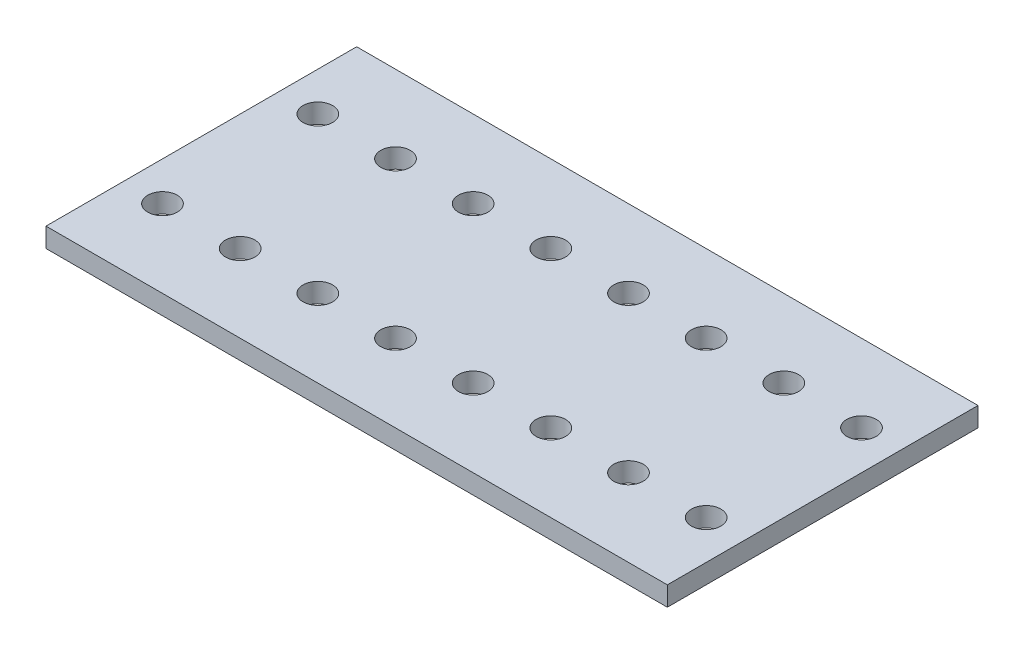
ISO-10303-21;
HEADER;
FILE_DESCRIPTION(('STEP AP214'),'2;1');
FILE_NAME('part.step','',(''),(''),'','','');
FILE_SCHEMA(('AUTOMOTIVE_DESIGN { 1 0 10303 214 1 1 1 1 }'));
ENDSEC;
DATA;
#1=APPLICATION_CONTEXT('core data for automotive mechanical design processes');
#2=APPLICATION_PROTOCOL_DEFINITION('international standard','automotive_design',2000,#1);
#3=PRODUCT_CONTEXT('',#1,'mechanical');
#4=PRODUCT('Part','Part','',(#3));
#5=PRODUCT_RELATED_PRODUCT_CATEGORY('part','',(#4));
#6=PRODUCT_DEFINITION_FORMATION('','',#4);
#7=PRODUCT_DEFINITION_CONTEXT('part definition',#1,'design');
#8=PRODUCT_DEFINITION('design','',#6,#7);
#9=PRODUCT_DEFINITION_SHAPE('','',#8);
#10=(LENGTH_UNIT() NAMED_UNIT(*) SI_UNIT(.MILLI.,.METRE.));
#11=(NAMED_UNIT(*) PLANE_ANGLE_UNIT() SI_UNIT($,.RADIAN.));
#12=(NAMED_UNIT(*) SI_UNIT($,.STERADIAN.) SOLID_ANGLE_UNIT());
#13=UNCERTAINTY_MEASURE_WITH_UNIT(LENGTH_MEASURE(1.E-05),#10,'distance_accuracy_value','');
#14=(GEOMETRIC_REPRESENTATION_CONTEXT(3) GLOBAL_UNCERTAINTY_ASSIGNED_CONTEXT((#13)) GLOBAL_UNIT_ASSIGNED_CONTEXT((#10,
#11,#12)) REPRESENTATION_CONTEXT('',''));
#15=CARTESIAN_POINT('',(0.,0.,0.));
#16=DIRECTION('',(0.,0.,1.));
#17=DIRECTION('',(1.,0.,0.));
#18=AXIS2_PLACEMENT_3D('',#15,#16,#17);
#19=CARTESIAN_POINT('',(0.,3.175,0.));
#20=DIRECTION('',(1.,0.,0.));
#21=DIRECTION('',(0.,0.,-1.));
#22=AXIS2_PLACEMENT_3D('',#19,#20,#21);
#23=PLANE('',#22);
#24=DIRECTION('',(0.,0.,1.));
#25=VECTOR('',#24,1.);
#26=CARTESIAN_POINT('',(0.,0.,0.));
#27=LINE('',#26,#25);
#28=CARTESIAN_POINT('',(0.,0.,-50.8));
#29=VERTEX_POINT('',#28);
#30=CARTESIAN_POINT('',(0.,0.,0.));
#31=VERTEX_POINT('',#30);
#32=EDGE_CURVE('E107',#29,#31,#27,.T.);
#33=ORIENTED_EDGE('',*,*,#32,.T.);
#34=DIRECTION('',(0.,-1.,0.));
#35=VECTOR('',#34,1.);
#36=CARTESIAN_POINT('',(0.,3.175,0.));
#37=LINE('',#36,#35);
#38=CARTESIAN_POINT('',(0.,3.175,0.));
#39=VERTEX_POINT('',#38);
#40=EDGE_CURVE('E11',#39,#31,#37,.T.);
#41=ORIENTED_EDGE('',*,*,#40,.F.);
#42=DIRECTION('',(0.,0.,1.));
#43=VECTOR('',#42,1.);
#44=CARTESIAN_POINT('',(0.,3.175,0.));
#45=LINE('',#44,#43);
#46=CARTESIAN_POINT('',(0.,3.175,-50.8));
#47=VERTEX_POINT('',#46);
#48=EDGE_CURVE('E91',#47,#39,#45,.T.);
#49=ORIENTED_EDGE('',*,*,#48,.F.);
#50=DIRECTION('',(0.,-1.,0.));
#51=VECTOR('',#50,1.);
#52=CARTESIAN_POINT('',(0.,3.175,-50.8));
#53=LINE('',#52,#51);
#54=EDGE_CURVE('E103',#47,#29,#53,.T.);
#55=ORIENTED_EDGE('',*,*,#54,.T.);
#56=EDGE_LOOP('',(#33,#41,#49,#55));
#57=FACE_BOUND('',#56,.T.);
#58=ADVANCED_FACE('F39',(#57),#23,.F.);
#59=CARTESIAN_POINT('',(0.,3.175,0.));
#60=DIRECTION('',(0.,0.,-1.));
#61=DIRECTION('',(-1.,0.,0.));
#62=AXIS2_PLACEMENT_3D('',#59,#60,#61);
#63=PLANE('',#62);
#64=DIRECTION('',(1.,0.,0.));
#65=VECTOR('',#64,1.);
#66=CARTESIAN_POINT('',(0.,0.,0.));
#67=LINE('',#66,#65);
#68=CARTESIAN_POINT('',(101.6,0.,0.));
#69=VERTEX_POINT('',#68);
#70=EDGE_CURVE('E96',#31,#69,#67,.T.);
#71=ORIENTED_EDGE('',*,*,#70,.T.);
#72=DIRECTION('',(0.,-1.,0.));
#73=VECTOR('',#72,1.);
#74=CARTESIAN_POINT('',(101.6,3.175,0.));
#75=LINE('',#74,#73);
#76=CARTESIAN_POINT('',(101.6,3.175,0.));
#77=VERTEX_POINT('',#76);
#78=EDGE_CURVE('E48',#77,#69,#75,.T.);
#79=ORIENTED_EDGE('',*,*,#78,.F.);
#80=DIRECTION('',(1.,0.,0.));
#81=VECTOR('',#80,1.);
#82=CARTESIAN_POINT('',(0.,3.175,0.));
#83=LINE('',#82,#81);
#84=EDGE_CURVE('E86',#39,#77,#83,.T.);
#85=ORIENTED_EDGE('',*,*,#84,.F.);
#86=ORIENTED_EDGE('',*,*,#40,.T.);
#87=EDGE_LOOP('',(#71,#79,#85,#86));
#88=FACE_BOUND('',#87,.T.);
#89=ADVANCED_FACE('F95',(#88),#63,.F.);
#90=CARTESIAN_POINT('',(101.6,3.175,0.));
#91=DIRECTION('',(-1.,0.,0.));
#92=DIRECTION('',(0.,0.,1.));
#93=AXIS2_PLACEMENT_3D('',#90,#91,#92);
#94=PLANE('',#93);
#95=DIRECTION('',(0.,0.,-1.));
#96=VECTOR('',#95,1.);
#97=CARTESIAN_POINT('',(101.6,0.,0.));
#98=LINE('',#97,#96);
#99=CARTESIAN_POINT('',(101.6,0.,-50.8));
#100=VERTEX_POINT('',#99);
#101=EDGE_CURVE('E73',#69,#100,#98,.T.);
#102=ORIENTED_EDGE('',*,*,#101,.T.);
#103=DIRECTION('',(0.,-1.,0.));
#104=VECTOR('',#103,1.);
#105=CARTESIAN_POINT('',(101.6,3.175,-50.8));
#106=LINE('',#105,#104);
#107=CARTESIAN_POINT('',(101.6,3.175,-50.8));
#108=VERTEX_POINT('',#107);
#109=EDGE_CURVE('E98',#108,#100,#106,.T.);
#110=ORIENTED_EDGE('',*,*,#109,.F.);
#111=DIRECTION('',(0.,0.,-1.));
#112=VECTOR('',#111,1.);
#113=CARTESIAN_POINT('',(101.6,3.175,0.));
#114=LINE('',#113,#112);
#115=EDGE_CURVE('E89',#77,#108,#114,.T.);
#116=ORIENTED_EDGE('',*,*,#115,.F.);
#117=ORIENTED_EDGE('',*,*,#78,.T.);
#118=EDGE_LOOP('',(#102,#110,#116,#117));
#119=FACE_BOUND('',#118,.T.);
#120=ADVANCED_FACE('F99',(#119),#94,.F.);
#121=CARTESIAN_POINT('',(0.,3.175,-50.8));
#122=DIRECTION('',(0.,0.,1.));
#123=DIRECTION('',(1.,0.,0.));
#124=AXIS2_PLACEMENT_3D('',#121,#122,#123);
#125=PLANE('',#124);
#126=DIRECTION('',(-1.,0.,0.));
#127=VECTOR('',#126,1.);
#128=CARTESIAN_POINT('',(0.,0.,-50.8));
#129=LINE('',#128,#127);
#130=EDGE_CURVE('E79',#100,#29,#129,.T.);
#131=ORIENTED_EDGE('',*,*,#130,.T.);
#132=ORIENTED_EDGE('',*,*,#54,.F.);
#133=DIRECTION('',(-1.,0.,0.));
#134=VECTOR('',#133,1.);
#135=CARTESIAN_POINT('',(0.,3.175,-50.8));
#136=LINE('',#135,#134);
#137=EDGE_CURVE('E56',#108,#47,#136,.T.);
#138=ORIENTED_EDGE('',*,*,#137,.F.);
#139=ORIENTED_EDGE('',*,*,#109,.T.);
#140=EDGE_LOOP('',(#131,#132,#138,#139));
#141=FACE_BOUND('',#140,.T.);
#142=ADVANCED_FACE('F121',(#141),#125,.F.);
#143=CARTESIAN_POINT('',(0.,3.175,0.));
#144=DIRECTION('',(0.,-1.,0.));
#145=DIRECTION('',(0.,0.,-1.));
#146=AXIS2_PLACEMENT_3D('',#143,#144,#145);
#147=PLANE('',#146);
#148=CARTESIAN_POINT('',(31.75,3.175,-12.7));
#149=DIRECTION('',(0.,1.,0.));
#150=DIRECTION('',(0.,0.,1.));
#151=AXIS2_PLACEMENT_3D('',#148,#149,#150);
#152=CIRCLE('',#151,2.413);
#153=CARTESIAN_POINT('',(31.75,3.175,-10.287));
#154=VERTEX_POINT('',#153);
#155=EDGE_CURVE('E177',#154,#154,#152,.T.);
#156=ORIENTED_EDGE('',*,*,#155,.F.);
#157=EDGE_LOOP('',(#156));
#158=FACE_BOUND('',#157,.T.);
#159=CARTESIAN_POINT('',(44.45,3.175,-38.1));
#160=DIRECTION('',(0.,1.,0.));
#161=DIRECTION('',(0.,0.,1.));
#162=AXIS2_PLACEMENT_3D('',#159,#160,#161);
#163=CIRCLE('',#162,2.413);
#164=CARTESIAN_POINT('',(44.45,3.175,-35.687));
#165=VERTEX_POINT('',#164);
#166=EDGE_CURVE('E168',#165,#165,#163,.T.);
#167=ORIENTED_EDGE('',*,*,#166,.F.);
#168=EDGE_LOOP('',(#167));
#169=FACE_BOUND('',#168,.T.);
#170=CARTESIAN_POINT('',(44.45,3.175,-12.7));
#171=DIRECTION('',(0.,1.,0.));
#172=DIRECTION('',(0.,0.,1.));
#173=AXIS2_PLACEMENT_3D('',#170,#171,#172);
#174=CIRCLE('',#173,2.413);
#175=CARTESIAN_POINT('',(44.45,3.175,-10.287));
#176=VERTEX_POINT('',#175);
#177=EDGE_CURVE('E193',#176,#176,#174,.T.);
#178=ORIENTED_EDGE('',*,*,#177,.F.);
#179=EDGE_LOOP('',(#178));
#180=FACE_BOUND('',#179,.T.);
#181=CARTESIAN_POINT('',(57.15,3.175,-38.1));
#182=DIRECTION('',(0.,1.,0.));
#183=DIRECTION('',(0.,0.,1.));
#184=AXIS2_PLACEMENT_3D('',#181,#182,#183);
#185=CIRCLE('',#184,2.413);
#186=CARTESIAN_POINT('',(57.15,3.175,-35.687));
#187=VERTEX_POINT('',#186);
#188=EDGE_CURVE('E184',#187,#187,#185,.T.);
#189=ORIENTED_EDGE('',*,*,#188,.F.);
#190=EDGE_LOOP('',(#189));
#191=FACE_BOUND('',#190,.T.);
#192=CARTESIAN_POINT('',(6.35,3.175,-12.7));
#193=DIRECTION('',(0.,1.,0.));
#194=DIRECTION('',(0.,0.,1.));
#195=AXIS2_PLACEMENT_3D('',#192,#193,#194);
#196=CIRCLE('',#195,2.413);
#197=CARTESIAN_POINT('',(6.35,3.175,-10.287));
#198=VERTEX_POINT('',#197);
#199=EDGE_CURVE('E145',#198,#198,#196,.T.);
#200=ORIENTED_EDGE('',*,*,#199,.F.);
#201=EDGE_LOOP('',(#200));
#202=FACE_BOUND('',#201,.T.);
#203=CARTESIAN_POINT('',(19.05,3.175,-38.1));
#204=DIRECTION('',(0.,1.,0.));
#205=DIRECTION('',(0.,0.,1.));
#206=AXIS2_PLACEMENT_3D('',#203,#204,#205);
#207=CIRCLE('',#206,2.413);
#208=CARTESIAN_POINT('',(19.05,3.175,-35.687));
#209=VERTEX_POINT('',#208);
#210=EDGE_CURVE('E136',#209,#209,#207,.T.);
#211=ORIENTED_EDGE('',*,*,#210,.F.);
#212=EDGE_LOOP('',(#211));
#213=FACE_BOUND('',#212,.T.);
#214=CARTESIAN_POINT('',(19.05,3.175,-12.7));
#215=DIRECTION('',(0.,1.,0.));
#216=DIRECTION('',(0.,0.,1.));
#217=AXIS2_PLACEMENT_3D('',#214,#215,#216);
#218=CIRCLE('',#217,2.413);
#219=CARTESIAN_POINT('',(19.05,3.175,-10.287));
#220=VERTEX_POINT('',#219);
#221=EDGE_CURVE('E161',#220,#220,#218,.T.);
#222=ORIENTED_EDGE('',*,*,#221,.F.);
#223=EDGE_LOOP('',(#222));
#224=FACE_BOUND('',#223,.T.);
#225=CARTESIAN_POINT('',(31.75,3.175,-38.1));
#226=DIRECTION('',(0.,1.,0.));
#227=DIRECTION('',(0.,0.,1.));
#228=AXIS2_PLACEMENT_3D('',#225,#226,#227);
#229=CIRCLE('',#228,2.41299999999999);
#230=CARTESIAN_POINT('',(31.75,3.175,-35.687));
#231=VERTEX_POINT('',#230);
#232=EDGE_CURVE('E152',#231,#231,#229,.T.);
#233=ORIENTED_EDGE('',*,*,#232,.F.);
#234=EDGE_LOOP('',(#233));
#235=FACE_BOUND('',#234,.T.);
#236=CARTESIAN_POINT('',(82.55,3.175,-12.7));
#237=DIRECTION('',(0.,1.,0.));
#238=DIRECTION('',(0.,0.,1.));
#239=AXIS2_PLACEMENT_3D('',#236,#237,#238);
#240=CIRCLE('',#239,2.41300000000001);
#241=CARTESIAN_POINT('',(82.55,3.175,-10.287));
#242=VERTEX_POINT('',#241);
#243=EDGE_CURVE('E241',#242,#242,#240,.T.);
#244=ORIENTED_EDGE('',*,*,#243,.F.);
#245=EDGE_LOOP('',(#244));
#246=FACE_BOUND('',#245,.T.);
#247=CARTESIAN_POINT('',(95.25,3.175,-38.1));
#248=DIRECTION('',(0.,1.,0.));
#249=DIRECTION('',(0.,0.,1.));
#250=AXIS2_PLACEMENT_3D('',#247,#248,#249);
#251=CIRCLE('',#250,2.41300000000001);
#252=CARTESIAN_POINT('',(95.25,3.175,-35.687));
#253=VERTEX_POINT('',#252);
#254=EDGE_CURVE('E232',#253,#253,#251,.T.);
#255=ORIENTED_EDGE('',*,*,#254,.F.);
#256=EDGE_LOOP('',(#255));
#257=FACE_BOUND('',#256,.T.);
#258=CARTESIAN_POINT('',(95.25,3.175,-12.7));
#259=DIRECTION('',(0.,1.,0.));
#260=DIRECTION('',(0.,0.,1.));
#261=AXIS2_PLACEMENT_3D('',#258,#259,#260);
#262=CIRCLE('',#261,2.41300000000001);
#263=CARTESIAN_POINT('',(95.25,3.175,-10.287));
#264=VERTEX_POINT('',#263);
#265=EDGE_CURVE('E248',#264,#264,#262,.T.);
#266=ORIENTED_EDGE('',*,*,#265,.F.);
#267=EDGE_LOOP('',(#266));
#268=FACE_BOUND('',#267,.T.);
#269=CARTESIAN_POINT('',(57.15,3.175,-12.7));
#270=DIRECTION('',(0.,1.,0.));
#271=DIRECTION('',(0.,0.,1.));
#272=AXIS2_PLACEMENT_3D('',#269,#270,#271);
#273=CIRCLE('',#272,2.413);
#274=CARTESIAN_POINT('',(57.15,3.175,-10.287));
#275=VERTEX_POINT('',#274);
#276=EDGE_CURVE('E209',#275,#275,#273,.T.);
#277=ORIENTED_EDGE('',*,*,#276,.F.);
#278=EDGE_LOOP('',(#277));
#279=FACE_BOUND('',#278,.T.);
#280=CARTESIAN_POINT('',(69.85,3.175,-38.1));
#281=DIRECTION('',(0.,1.,0.));
#282=DIRECTION('',(0.,0.,1.));
#283=AXIS2_PLACEMENT_3D('',#280,#281,#282);
#284=CIRCLE('',#283,2.41300000000001);
#285=CARTESIAN_POINT('',(69.85,3.175,-35.687));
#286=VERTEX_POINT('',#285);
#287=EDGE_CURVE('E200',#286,#286,#284,.T.);
#288=ORIENTED_EDGE('',*,*,#287,.F.);
#289=EDGE_LOOP('',(#288));
#290=FACE_BOUND('',#289,.T.);
#291=CARTESIAN_POINT('',(69.85,3.175,-12.7));
#292=DIRECTION('',(0.,1.,0.));
#293=DIRECTION('',(0.,0.,1.));
#294=AXIS2_PLACEMENT_3D('',#291,#292,#293);
#295=CIRCLE('',#294,2.41300000000001);
#296=CARTESIAN_POINT('',(69.85,3.175,-10.287));
#297=VERTEX_POINT('',#296);
#298=EDGE_CURVE('E225',#297,#297,#295,.T.);
#299=ORIENTED_EDGE('',*,*,#298,.F.);
#300=EDGE_LOOP('',(#299));
#301=FACE_BOUND('',#300,.T.);
#302=CARTESIAN_POINT('',(82.55,3.175,-38.1));
#303=DIRECTION('',(0.,1.,0.));
#304=DIRECTION('',(0.,0.,1.));
#305=AXIS2_PLACEMENT_3D('',#302,#303,#304);
#306=CIRCLE('',#305,2.41300000000001);
#307=CARTESIAN_POINT('',(82.55,3.175,-35.687));
#308=VERTEX_POINT('',#307);
#309=EDGE_CURVE('E216',#308,#308,#306,.T.);
#310=ORIENTED_EDGE('',*,*,#309,.F.);
#311=EDGE_LOOP('',(#310));
#312=FACE_BOUND('',#311,.T.);
#313=CARTESIAN_POINT('',(6.35,3.175,-38.1));
#314=DIRECTION('',(0.,1.,0.));
#315=DIRECTION('',(0.,0.,1.));
#316=AXIS2_PLACEMENT_3D('',#313,#314,#315);
#317=CIRCLE('',#316,2.413);
#318=CARTESIAN_POINT('',(6.35,3.175,-35.687));
#319=VERTEX_POINT('',#318);
#320=EDGE_CURVE('E128',#319,#319,#317,.T.);
#321=ORIENTED_EDGE('',*,*,#320,.F.);
#322=EDGE_LOOP('',(#321));
#323=FACE_BOUND('',#322,.T.);
#324=ORIENTED_EDGE('',*,*,#48,.T.);
#325=ORIENTED_EDGE('',*,*,#84,.T.);
#326=ORIENTED_EDGE('',*,*,#115,.T.);
#327=ORIENTED_EDGE('',*,*,#137,.T.);
#328=EDGE_LOOP('',(#324,#325,#326,#327));
#329=FACE_BOUND('',#328,.T.);
#330=ADVANCED_FACE('F87',(#158,#169,#180,#191,#202,#213,#224,#235,#246,#257,#268,#279,#290,#301,
#312,#323,#329),#147,.F.);
#331=CARTESIAN_POINT('',(0.,0.,0.));
#332=DIRECTION('',(0.,-1.,0.));
#333=DIRECTION('',(0.,0.,-1.));
#334=AXIS2_PLACEMENT_3D('',#331,#332,#333);
#335=PLANE('',#334);
#336=CARTESIAN_POINT('',(31.75,0.,-12.7));
#337=DIRECTION('',(0.,1.,0.));
#338=DIRECTION('',(0.,0.,1.));
#339=AXIS2_PLACEMENT_3D('',#336,#337,#338);
#340=CIRCLE('',#339,2.413);
#341=CARTESIAN_POINT('',(31.75,0.,-10.287));
#342=VERTEX_POINT('',#341);
#343=EDGE_CURVE('E157',#342,#342,#340,.T.);
#344=ORIENTED_EDGE('',*,*,#343,.T.);
#345=EDGE_LOOP('',(#344));
#346=FACE_BOUND('',#345,.T.);
#347=CARTESIAN_POINT('',(44.45,0.,-38.1));
#348=DIRECTION('',(0.,1.,0.));
#349=DIRECTION('',(0.,0.,1.));
#350=AXIS2_PLACEMENT_3D('',#347,#348,#349);
#351=CIRCLE('',#350,2.413);
#352=CARTESIAN_POINT('',(44.45,0.,-35.687));
#353=VERTEX_POINT('',#352);
#354=EDGE_CURVE('E172',#353,#353,#351,.T.);
#355=ORIENTED_EDGE('',*,*,#354,.T.);
#356=EDGE_LOOP('',(#355));
#357=FACE_BOUND('',#356,.T.);
#358=CARTESIAN_POINT('',(44.45,0.,-12.7));
#359=DIRECTION('',(0.,1.,0.));
#360=DIRECTION('',(0.,0.,1.));
#361=AXIS2_PLACEMENT_3D('',#358,#359,#360);
#362=CIRCLE('',#361,2.413);
#363=CARTESIAN_POINT('',(44.45,0.,-10.287));
#364=VERTEX_POINT('',#363);
#365=EDGE_CURVE('E173',#364,#364,#362,.T.);
#366=ORIENTED_EDGE('',*,*,#365,.T.);
#367=EDGE_LOOP('',(#366));
#368=FACE_BOUND('',#367,.T.);
#369=CARTESIAN_POINT('',(57.15,0.,-38.1));
#370=DIRECTION('',(0.,1.,0.));
#371=DIRECTION('',(0.,0.,1.));
#372=AXIS2_PLACEMENT_3D('',#369,#370,#371);
#373=CIRCLE('',#372,2.413);
#374=CARTESIAN_POINT('',(57.15,0.,-35.687));
#375=VERTEX_POINT('',#374);
#376=EDGE_CURVE('E188',#375,#375,#373,.T.);
#377=ORIENTED_EDGE('',*,*,#376,.T.);
#378=EDGE_LOOP('',(#377));
#379=FACE_BOUND('',#378,.T.);
#380=CARTESIAN_POINT('',(6.35,0.,-12.7));
#381=DIRECTION('',(0.,1.,0.));
#382=DIRECTION('',(0.,0.,1.));
#383=AXIS2_PLACEMENT_3D('',#380,#381,#382);
#384=CIRCLE('',#383,2.413);
#385=CARTESIAN_POINT('',(6.35,0.,-10.287));
#386=VERTEX_POINT('',#385);
#387=EDGE_CURVE('E132',#386,#386,#384,.T.);
#388=ORIENTED_EDGE('',*,*,#387,.T.);
#389=EDGE_LOOP('',(#388));
#390=FACE_BOUND('',#389,.T.);
#391=CARTESIAN_POINT('',(19.05,0.,-38.1));
#392=DIRECTION('',(0.,1.,0.));
#393=DIRECTION('',(0.,0.,1.));
#394=AXIS2_PLACEMENT_3D('',#391,#392,#393);
#395=CIRCLE('',#394,2.413);
#396=CARTESIAN_POINT('',(19.05,0.,-35.687));
#397=VERTEX_POINT('',#396);
#398=EDGE_CURVE('E140',#397,#397,#395,.T.);
#399=ORIENTED_EDGE('',*,*,#398,.T.);
#400=EDGE_LOOP('',(#399));
#401=FACE_BOUND('',#400,.T.);
#402=CARTESIAN_POINT('',(19.05,0.,-12.7));
#403=DIRECTION('',(0.,1.,0.));
#404=DIRECTION('',(0.,0.,1.));
#405=AXIS2_PLACEMENT_3D('',#402,#403,#404);
#406=CIRCLE('',#405,2.413);
#407=CARTESIAN_POINT('',(19.05,0.,-10.287));
#408=VERTEX_POINT('',#407);
#409=EDGE_CURVE('E141',#408,#408,#406,.T.);
#410=ORIENTED_EDGE('',*,*,#409,.T.);
#411=EDGE_LOOP('',(#410));
#412=FACE_BOUND('',#411,.T.);
#413=CARTESIAN_POINT('',(31.75,0.,-38.1));
#414=DIRECTION('',(0.,1.,0.));
#415=DIRECTION('',(0.,0.,1.));
#416=AXIS2_PLACEMENT_3D('',#413,#414,#415);
#417=CIRCLE('',#416,2.41299999999999);
#418=CARTESIAN_POINT('',(31.75,0.,-35.687));
#419=VERTEX_POINT('',#418);
#420=EDGE_CURVE('E156',#419,#419,#417,.T.);
#421=ORIENTED_EDGE('',*,*,#420,.T.);
#422=EDGE_LOOP('',(#421));
#423=FACE_BOUND('',#422,.T.);
#424=CARTESIAN_POINT('',(82.55,0.,-12.7));
#425=DIRECTION('',(0.,1.,0.));
#426=DIRECTION('',(0.,0.,1.));
#427=AXIS2_PLACEMENT_3D('',#424,#425,#426);
#428=CIRCLE('',#427,2.41300000000001);
#429=CARTESIAN_POINT('',(82.55,0.,-10.287));
#430=VERTEX_POINT('',#429);
#431=EDGE_CURVE('E221',#430,#430,#428,.T.);
#432=ORIENTED_EDGE('',*,*,#431,.T.);
#433=EDGE_LOOP('',(#432));
#434=FACE_BOUND('',#433,.T.);
#435=CARTESIAN_POINT('',(95.25,0.,-38.1));
#436=DIRECTION('',(0.,1.,0.));
#437=DIRECTION('',(0.,0.,1.));
#438=AXIS2_PLACEMENT_3D('',#435,#436,#437);
#439=CIRCLE('',#438,2.41300000000001);
#440=CARTESIAN_POINT('',(95.25,0.,-35.687));
#441=VERTEX_POINT('',#440);
#442=EDGE_CURVE('E236',#441,#441,#439,.T.);
#443=ORIENTED_EDGE('',*,*,#442,.T.);
#444=EDGE_LOOP('',(#443));
#445=FACE_BOUND('',#444,.T.);
#446=CARTESIAN_POINT('',(95.25,0.,-12.7));
#447=DIRECTION('',(0.,1.,0.));
#448=DIRECTION('',(0.,0.,1.));
#449=AXIS2_PLACEMENT_3D('',#446,#447,#448);
#450=CIRCLE('',#449,2.41300000000001);
#451=CARTESIAN_POINT('',(95.25,0.,-10.287));
#452=VERTEX_POINT('',#451);
#453=EDGE_CURVE('E237',#452,#452,#450,.T.);
#454=ORIENTED_EDGE('',*,*,#453,.T.);
#455=EDGE_LOOP('',(#454));
#456=FACE_BOUND('',#455,.T.);
#457=CARTESIAN_POINT('',(57.15,0.,-12.7));
#458=DIRECTION('',(0.,1.,0.));
#459=DIRECTION('',(0.,0.,1.));
#460=AXIS2_PLACEMENT_3D('',#457,#458,#459);
#461=CIRCLE('',#460,2.413);
#462=CARTESIAN_POINT('',(57.15,0.,-10.287));
#463=VERTEX_POINT('',#462);
#464=EDGE_CURVE('E189',#463,#463,#461,.T.);
#465=ORIENTED_EDGE('',*,*,#464,.T.);
#466=EDGE_LOOP('',(#465));
#467=FACE_BOUND('',#466,.T.);
#468=CARTESIAN_POINT('',(69.85,0.,-38.1));
#469=DIRECTION('',(0.,1.,0.));
#470=DIRECTION('',(0.,0.,1.));
#471=AXIS2_PLACEMENT_3D('',#468,#469,#470);
#472=CIRCLE('',#471,2.41300000000001);
#473=CARTESIAN_POINT('',(69.85,0.,-35.687));
#474=VERTEX_POINT('',#473);
#475=EDGE_CURVE('E204',#474,#474,#472,.T.);
#476=ORIENTED_EDGE('',*,*,#475,.T.);
#477=EDGE_LOOP('',(#476));
#478=FACE_BOUND('',#477,.T.);
#479=CARTESIAN_POINT('',(69.85,0.,-12.7));
#480=DIRECTION('',(0.,1.,0.));
#481=DIRECTION('',(0.,0.,1.));
#482=AXIS2_PLACEMENT_3D('',#479,#480,#481);
#483=CIRCLE('',#482,2.41300000000001);
#484=CARTESIAN_POINT('',(69.85,0.,-10.287));
#485=VERTEX_POINT('',#484);
#486=EDGE_CURVE('E205',#485,#485,#483,.T.);
#487=ORIENTED_EDGE('',*,*,#486,.T.);
#488=EDGE_LOOP('',(#487));
#489=FACE_BOUND('',#488,.T.);
#490=CARTESIAN_POINT('',(82.55,0.,-38.1));
#491=DIRECTION('',(0.,1.,0.));
#492=DIRECTION('',(0.,0.,1.));
#493=AXIS2_PLACEMENT_3D('',#490,#491,#492);
#494=CIRCLE('',#493,2.41300000000001);
#495=CARTESIAN_POINT('',(82.55,0.,-35.687));
#496=VERTEX_POINT('',#495);
#497=EDGE_CURVE('E220',#496,#496,#494,.T.);
#498=ORIENTED_EDGE('',*,*,#497,.T.);
#499=EDGE_LOOP('',(#498));
#500=FACE_BOUND('',#499,.T.);
#501=CARTESIAN_POINT('',(6.35,0.,-38.1));
#502=DIRECTION('',(0.,1.,0.));
#503=DIRECTION('',(0.,0.,1.));
#504=AXIS2_PLACEMENT_3D('',#501,#502,#503);
#505=CIRCLE('',#504,2.413);
#506=CARTESIAN_POINT('',(6.35,0.,-35.687));
#507=VERTEX_POINT('',#506);
#508=EDGE_CURVE('E111',#507,#507,#505,.T.);
#509=ORIENTED_EDGE('',*,*,#508,.T.);
#510=EDGE_LOOP('',(#509));
#511=FACE_BOUND('',#510,.T.);
#512=ORIENTED_EDGE('',*,*,#32,.F.);
#513=ORIENTED_EDGE('',*,*,#130,.F.);
#514=ORIENTED_EDGE('',*,*,#101,.F.);
#515=ORIENTED_EDGE('',*,*,#70,.F.);
#516=EDGE_LOOP('',(#512,#513,#514,#515));
#517=FACE_BOUND('',#516,.T.);
#518=ADVANCED_FACE('F124',(#346,#357,#368,#379,#390,#401,#412,#423,#434,#445,#456,#467,#478,
#489,#500,#511,#517),#335,.T.);
#519=CARTESIAN_POINT('',(6.35,0.,-38.1));
#520=DIRECTION('',(0.,1.,0.));
#521=DIRECTION('',(0.,0.,1.));
#522=AXIS2_PLACEMENT_3D('',#519,#520,#521);
#523=CYLINDRICAL_SURFACE('',#522,2.413);
#524=ORIENTED_EDGE('',*,*,#508,.F.);
#525=EDGE_LOOP('',(#524));
#526=FACE_BOUND('',#525,.T.);
#527=ORIENTED_EDGE('',*,*,#320,.T.);
#528=EDGE_LOOP('',(#527));
#529=FACE_BOUND('',#528,.T.);
#530=ADVANCED_FACE('F280',(#526,#529),#523,.F.);
#531=CARTESIAN_POINT('',(82.55,0.,-38.1));
#532=DIRECTION('',(0.,1.,0.));
#533=DIRECTION('',(0.,0.,1.));
#534=AXIS2_PLACEMENT_3D('',#531,#532,#533);
#535=CYLINDRICAL_SURFACE('',#534,2.41300000000001);
#536=ORIENTED_EDGE('',*,*,#497,.F.);
#537=EDGE_LOOP('',(#536));
#538=FACE_BOUND('',#537,.T.);
#539=ORIENTED_EDGE('',*,*,#309,.T.);
#540=EDGE_LOOP('',(#539));
#541=FACE_BOUND('',#540,.T.);
#542=ADVANCED_FACE('F282',(#538,#541),#535,.F.);
#543=CARTESIAN_POINT('',(69.85,0.,-12.7));
#544=DIRECTION('',(0.,1.,0.));
#545=DIRECTION('',(0.,0.,1.));
#546=AXIS2_PLACEMENT_3D('',#543,#544,#545);
#547=CYLINDRICAL_SURFACE('',#546,2.41300000000001);
#548=ORIENTED_EDGE('',*,*,#486,.F.);
#549=EDGE_LOOP('',(#548));
#550=FACE_BOUND('',#549,.T.);
#551=ORIENTED_EDGE('',*,*,#298,.T.);
#552=EDGE_LOOP('',(#551));
#553=FACE_BOUND('',#552,.T.);
#554=ADVANCED_FACE('F289',(#550,#553),#547,.F.);
#555=CARTESIAN_POINT('',(69.85,0.,-38.1));
#556=DIRECTION('',(0.,1.,0.));
#557=DIRECTION('',(0.,0.,1.));
#558=AXIS2_PLACEMENT_3D('',#555,#556,#557);
#559=CYLINDRICAL_SURFACE('',#558,2.41300000000001);
#560=ORIENTED_EDGE('',*,*,#475,.F.);
#561=EDGE_LOOP('',(#560));
#562=FACE_BOUND('',#561,.T.);
#563=ORIENTED_EDGE('',*,*,#287,.T.);
#564=EDGE_LOOP('',(#563));
#565=FACE_BOUND('',#564,.T.);
#566=ADVANCED_FACE('F337',(#562,#565),#559,.F.);
#567=CARTESIAN_POINT('',(57.15,0.,-12.7));
#568=DIRECTION('',(0.,1.,0.));
#569=DIRECTION('',(0.,0.,1.));
#570=AXIS2_PLACEMENT_3D('',#567,#568,#569);
#571=CYLINDRICAL_SURFACE('',#570,2.413);
#572=ORIENTED_EDGE('',*,*,#464,.F.);
#573=EDGE_LOOP('',(#572));
#574=FACE_BOUND('',#573,.T.);
#575=ORIENTED_EDGE('',*,*,#276,.T.);
#576=EDGE_LOOP('',(#575));
#577=FACE_BOUND('',#576,.T.);
#578=ADVANCED_FACE('F262',(#574,#577),#571,.F.);
#579=CARTESIAN_POINT('',(95.25,0.,-12.7));
#580=DIRECTION('',(0.,1.,0.));
#581=DIRECTION('',(0.,0.,1.));
#582=AXIS2_PLACEMENT_3D('',#579,#580,#581);
#583=CYLINDRICAL_SURFACE('',#582,2.41300000000001);
#584=ORIENTED_EDGE('',*,*,#453,.F.);
#585=EDGE_LOOP('',(#584));
#586=FACE_BOUND('',#585,.T.);
#587=ORIENTED_EDGE('',*,*,#265,.T.);
#588=EDGE_LOOP('',(#587));
#589=FACE_BOUND('',#588,.T.);
#590=ADVANCED_FACE('F258',(#586,#589),#583,.F.);
#591=CARTESIAN_POINT('',(95.25,0.,-38.1));
#592=DIRECTION('',(0.,1.,0.));
#593=DIRECTION('',(0.,0.,1.));
#594=AXIS2_PLACEMENT_3D('',#591,#592,#593);
#595=CYLINDRICAL_SURFACE('',#594,2.41300000000001);
#596=ORIENTED_EDGE('',*,*,#442,.F.);
#597=EDGE_LOOP('',(#596));
#598=FACE_BOUND('',#597,.T.);
#599=ORIENTED_EDGE('',*,*,#254,.T.);
#600=EDGE_LOOP('',(#599));
#601=FACE_BOUND('',#600,.T.);
#602=ADVANCED_FACE('F261',(#598,#601),#595,.F.);
#603=CARTESIAN_POINT('',(82.55,0.,-12.7));
#604=DIRECTION('',(0.,1.,0.));
#605=DIRECTION('',(0.,0.,1.));
#606=AXIS2_PLACEMENT_3D('',#603,#604,#605);
#607=CYLINDRICAL_SURFACE('',#606,2.41300000000001);
#608=ORIENTED_EDGE('',*,*,#431,.F.);
#609=EDGE_LOOP('',(#608));
#610=FACE_BOUND('',#609,.T.);
#611=ORIENTED_EDGE('',*,*,#243,.T.);
#612=EDGE_LOOP('',(#611));
#613=FACE_BOUND('',#612,.T.);
#614=ADVANCED_FACE('F371',(#610,#613),#607,.F.);
#615=CARTESIAN_POINT('',(31.75,0.,-38.1));
#616=DIRECTION('',(0.,1.,0.));
#617=DIRECTION('',(0.,0.,1.));
#618=AXIS2_PLACEMENT_3D('',#615,#616,#617);
#619=CYLINDRICAL_SURFACE('',#618,2.41299999999999);
#620=ORIENTED_EDGE('',*,*,#420,.F.);
#621=EDGE_LOOP('',(#620));
#622=FACE_BOUND('',#621,.T.);
#623=ORIENTED_EDGE('',*,*,#232,.T.);
#624=EDGE_LOOP('',(#623));
#625=FACE_BOUND('',#624,.T.);
#626=ADVANCED_FACE('F381',(#622,#625),#619,.F.);
#627=CARTESIAN_POINT('',(19.05,0.,-12.7));
#628=DIRECTION('',(0.,1.,0.));
#629=DIRECTION('',(0.,0.,1.));
#630=AXIS2_PLACEMENT_3D('',#627,#628,#629);
#631=CYLINDRICAL_SURFACE('',#630,2.413);
#632=ORIENTED_EDGE('',*,*,#409,.F.);
#633=EDGE_LOOP('',(#632));
#634=FACE_BOUND('',#633,.T.);
#635=ORIENTED_EDGE('',*,*,#221,.T.);
#636=EDGE_LOOP('',(#635));
#637=FACE_BOUND('',#636,.T.);
#638=ADVANCED_FACE('F391',(#634,#637),#631,.F.);
#639=CARTESIAN_POINT('',(19.05,0.,-38.1));
#640=DIRECTION('',(0.,1.,0.));
#641=DIRECTION('',(0.,0.,1.));
#642=AXIS2_PLACEMENT_3D('',#639,#640,#641);
#643=CYLINDRICAL_SURFACE('',#642,2.413);
#644=ORIENTED_EDGE('',*,*,#398,.F.);
#645=EDGE_LOOP('',(#644));
#646=FACE_BOUND('',#645,.T.);
#647=ORIENTED_EDGE('',*,*,#210,.T.);
#648=EDGE_LOOP('',(#647));
#649=FACE_BOUND('',#648,.T.);
#650=ADVANCED_FACE('F401',(#646,#649),#643,.F.);
#651=CARTESIAN_POINT('',(6.35,0.,-12.7));
#652=DIRECTION('',(0.,1.,0.));
#653=DIRECTION('',(0.,0.,1.));
#654=AXIS2_PLACEMENT_3D('',#651,#652,#653);
#655=CYLINDRICAL_SURFACE('',#654,2.413);
#656=ORIENTED_EDGE('',*,*,#387,.F.);
#657=EDGE_LOOP('',(#656));
#658=FACE_BOUND('',#657,.T.);
#659=ORIENTED_EDGE('',*,*,#199,.T.);
#660=EDGE_LOOP('',(#659));
#661=FACE_BOUND('',#660,.T.);
#662=ADVANCED_FACE('F411',(#658,#661),#655,.F.);
#663=CARTESIAN_POINT('',(57.15,0.,-38.1));
#664=DIRECTION('',(0.,1.,0.));
#665=DIRECTION('',(0.,0.,1.));
#666=AXIS2_PLACEMENT_3D('',#663,#664,#665);
#667=CYLINDRICAL_SURFACE('',#666,2.413);
#668=ORIENTED_EDGE('',*,*,#376,.F.);
#669=EDGE_LOOP('',(#668));
#670=FACE_BOUND('',#669,.T.);
#671=ORIENTED_EDGE('',*,*,#188,.T.);
#672=EDGE_LOOP('',(#671));
#673=FACE_BOUND('',#672,.T.);
#674=ADVANCED_FACE('F420',(#670,#673),#667,.F.);
#675=CARTESIAN_POINT('',(44.45,0.,-12.7));
#676=DIRECTION('',(0.,1.,0.));
#677=DIRECTION('',(0.,0.,1.));
#678=AXIS2_PLACEMENT_3D('',#675,#676,#677);
#679=CYLINDRICAL_SURFACE('',#678,2.413);
#680=ORIENTED_EDGE('',*,*,#365,.F.);
#681=EDGE_LOOP('',(#680));
#682=FACE_BOUND('',#681,.T.);
#683=ORIENTED_EDGE('',*,*,#177,.T.);
#684=EDGE_LOOP('',(#683));
#685=FACE_BOUND('',#684,.T.);
#686=ADVANCED_FACE('F430',(#682,#685),#679,.F.);
#687=CARTESIAN_POINT('',(44.45,0.,-38.1));
#688=DIRECTION('',(0.,1.,0.));
#689=DIRECTION('',(0.,0.,1.));
#690=AXIS2_PLACEMENT_3D('',#687,#688,#689);
#691=CYLINDRICAL_SURFACE('',#690,2.413);
#692=ORIENTED_EDGE('',*,*,#354,.F.);
#693=EDGE_LOOP('',(#692));
#694=FACE_BOUND('',#693,.T.);
#695=ORIENTED_EDGE('',*,*,#166,.T.);
#696=EDGE_LOOP('',(#695));
#697=FACE_BOUND('',#696,.T.);
#698=ADVANCED_FACE('F440',(#694,#697),#691,.F.);
#699=CARTESIAN_POINT('',(31.75,0.,-12.7));
#700=DIRECTION('',(0.,1.,0.));
#701=DIRECTION('',(0.,0.,1.));
#702=AXIS2_PLACEMENT_3D('',#699,#700,#701);
#703=CYLINDRICAL_SURFACE('',#702,2.413);
#704=ORIENTED_EDGE('',*,*,#343,.F.);
#705=EDGE_LOOP('',(#704));
#706=FACE_BOUND('',#705,.T.);
#707=ORIENTED_EDGE('',*,*,#155,.T.);
#708=EDGE_LOOP('',(#707));
#709=FACE_BOUND('',#708,.T.);
#710=ADVANCED_FACE('F450',(#706,#709),#703,.F.);
#711=CLOSED_SHELL('',(#58,#89,#120,#142,#330,#518,#530,#542,#554,#566,#578,#590,#602,#614,#626,
#638,#650,#662,#674,#686,#698,#710));
#712=MANIFOLD_SOLID_BREP('B2',#711);
#713=ADVANCED_BREP_SHAPE_REPRESENTATION('',(#18,#712),#14);
#714=SHAPE_DEFINITION_REPRESENTATION(#9,#713);
ENDSEC;
END-ISO-10303-21;
